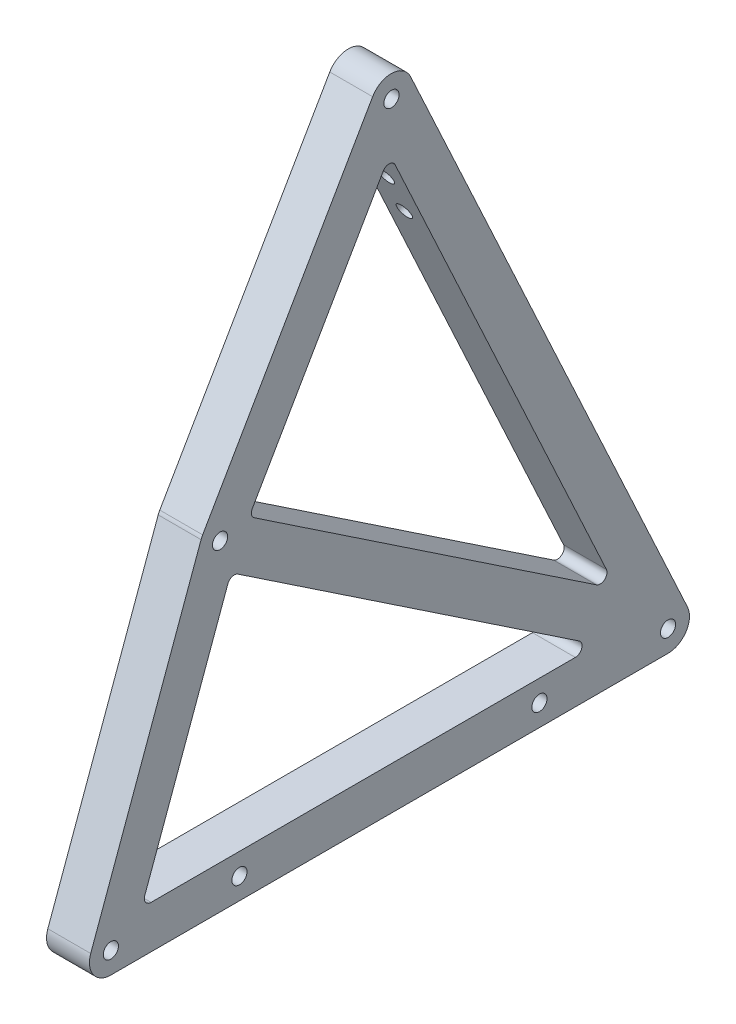
ISO-10303-21;
HEADER;
FILE_DESCRIPTION(('STEP AP214'),'2;1');
FILE_NAME('part.step','',(''),(''),'','','');
FILE_SCHEMA(('AUTOMOTIVE_DESIGN { 1 0 10303 214 1 1 1 1 }'));
ENDSEC;
DATA;
#1=APPLICATION_CONTEXT('core data for automotive mechanical design processes');
#2=APPLICATION_PROTOCOL_DEFINITION('international standard','automotive_design',2000,#1);
#3=PRODUCT_CONTEXT('',#1,'mechanical');
#4=PRODUCT('Part','Part','',(#3));
#5=PRODUCT_RELATED_PRODUCT_CATEGORY('part','',(#4));
#6=PRODUCT_DEFINITION_FORMATION('','',#4);
#7=PRODUCT_DEFINITION_CONTEXT('part definition',#1,'design');
#8=PRODUCT_DEFINITION('design','',#6,#7);
#9=PRODUCT_DEFINITION_SHAPE('','',#8);
#10=(LENGTH_UNIT() NAMED_UNIT(*) SI_UNIT(.MILLI.,.METRE.));
#11=(NAMED_UNIT(*) PLANE_ANGLE_UNIT() SI_UNIT($,.RADIAN.));
#12=(NAMED_UNIT(*) SI_UNIT($,.STERADIAN.) SOLID_ANGLE_UNIT());
#13=UNCERTAINTY_MEASURE_WITH_UNIT(LENGTH_MEASURE(1.E-05),#10,'distance_accuracy_value','');
#14=(GEOMETRIC_REPRESENTATION_CONTEXT(3) GLOBAL_UNCERTAINTY_ASSIGNED_CONTEXT((#13)) GLOBAL_UNIT_ASSIGNED_CONTEXT((#10,
#11,#12)) REPRESENTATION_CONTEXT('',''));
#15=CARTESIAN_POINT('',(0.,0.,0.));
#16=DIRECTION('',(0.,0.,1.));
#17=DIRECTION('',(1.,0.,0.));
#18=AXIS2_PLACEMENT_3D('',#15,#16,#17);
#19=CARTESIAN_POINT('',(12.7,0.,0.));
#20=DIRECTION('',(1.,0.,0.));
#21=DIRECTION('',(0.,0.,-1.));
#22=AXIS2_PLACEMENT_3D('',#19,#20,#21);
#23=PLANE('',#22);
#24=CARTESIAN_POINT('',(12.7,-88.9,-5.7430461737342));
#25=DIRECTION('',(1.,0.,0.));
#26=DIRECTION('',(0.,0.,-1.));
#27=AXIS2_PLACEMENT_3D('',#24,#25,#26);
#28=CIRCLE('',#27,2.25);
#29=CARTESIAN_POINT('',(12.7,-88.9,-7.9930461737342));
#30=VERTEX_POINT('',#29);
#31=EDGE_CURVE('E753',#30,#30,#28,.T.);
#32=ORIENTED_EDGE('',*,*,#31,.F.);
#33=EDGE_LOOP('',(#32));
#34=FACE_BOUND('',#33,.T.);
#35=CARTESIAN_POINT('',(12.7,-88.9,32.3569538262658));
#36=DIRECTION('',(1.,0.,0.));
#37=DIRECTION('',(0.,0.,-1.));
#38=AXIS2_PLACEMENT_3D('',#35,#36,#37);
#39=CIRCLE('',#38,2.25);
#40=CARTESIAN_POINT('',(12.7,-88.9,30.1069538262658));
#41=VERTEX_POINT('',#40);
#42=EDGE_CURVE('E737',#41,#41,#39,.T.);
#43=ORIENTED_EDGE('',*,*,#42,.F.);
#44=EDGE_LOOP('',(#43));
#45=FACE_BOUND('',#44,.T.);
#46=CARTESIAN_POINT('',(12.7,0.,0.));
#47=DIRECTION('',(1.,0.,0.));
#48=DIRECTION('',(0.,0.,-1.));
#49=AXIS2_PLACEMENT_3D('',#46,#47,#48);
#50=CIRCLE('',#49,2.25);
#51=CARTESIAN_POINT('',(12.7,0.,-2.25));
#52=VERTEX_POINT('',#51);
#53=EDGE_CURVE('E697',#52,#52,#50,.T.);
#54=ORIENTED_EDGE('',*,*,#53,.F.);
#55=EDGE_LOOP('',(#54));
#56=FACE_BOUND('',#55,.T.);
#57=DIRECTION('',(0.,0.,-1.));
#58=VECTOR('',#57,1.);
#59=CARTESIAN_POINT('',(12.7,-95.25,41.4256936690783));
#60=LINE('',#59,#58);
#61=CARTESIAN_POINT('',(12.7,-95.25,32.3569538262658));
#62=VERTEX_POINT('',#61);
#63=CARTESIAN_POINT('',(12.7,-95.25,-132.743046173734));
#64=VERTEX_POINT('',#63);
#65=EDGE_CURVE('E372',#62,#64,#60,.T.);
#66=ORIENTED_EDGE('',*,*,#65,.T.);
#67=CARTESIAN_POINT('',(12.7,-88.9,-132.743046173734));
#68=DIRECTION('',(1.,0.,0.));
#69=DIRECTION('',(0.,0.,-1.));
#70=AXIS2_PLACEMENT_3D('',#67,#68,#69);
#71=CIRCLE('',#70,6.35);
#72=CARTESIAN_POINT('',(12.7,-86.2308643075973,-138.504835362479));
#73=VERTEX_POINT('',#72);
#74=EDGE_CURVE('E243',#64,#73,#71,.T.);
#75=ORIENTED_EDGE('',*,*,#74,.T.);
#76=DIRECTION('',(0.,0.907368376180359,0.420336329512234));
#77=VECTOR('',#76,1.);
#78=CARTESIAN_POINT('',(12.7,-95.25,-142.682929388939));
#79=LINE('',#78,#77);
#80=CARTESIAN_POINT('',(12.7,90.8510513187063,-56.4720420765911));
#81=VERTEX_POINT('',#80);
#82=EDGE_CURVE('E198',#73,#81,#79,.T.);
#83=ORIENTED_EDGE('',*,*,#82,.T.);
#84=CARTESIAN_POINT('',(12.7,88.1819156263036,-50.7102528878458));
#85=DIRECTION('',(1.,0.,0.));
#86=DIRECTION('',(0.,0.,-1.));
#87=AXIS2_PLACEMENT_3D('',#84,#85,#86);
#88=CIRCLE('',#87,6.35);
#89=CARTESIAN_POINT('',(12.7,91.3569156263036,-45.2109915738146));
#90=VERTEX_POINT('',#89);
#91=EDGE_CURVE('E240',#81,#90,#88,.T.);
#92=ORIENTED_EDGE('',*,*,#91,.T.);
#93=DIRECTION('',(0.,-0.86602540378444,0.499999999999998));
#94=VECTOR('',#93,1.);
#95=CARTESIAN_POINT('',(12.7,101.953428548783,-51.3288911620796));
#96=LINE('',#95,#94);
#97=CARTESIAN_POINT('',(12.7,4.11979240632557,5.15538500056795));
#98=VERTEX_POINT('',#97);
#99=EDGE_CURVE('E220',#90,#98,#96,.T.);
#100=ORIENTED_EDGE('',*,*,#99,.T.);
#101=CARTESIAN_POINT('',(12.7,0.944792406325579,-0.343876313463227));
#102=DIRECTION('',(1.,0.,0.));
#103=DIRECTION('',(0.,0.,-1.));
#104=AXIS2_PLACEMENT_3D('',#101,#102,#103);
#105=CIRCLE('',#104,6.35);
#106=CARTESIAN_POINT('',(12.7,3.1166203164436,5.62317182852728));
#107=VERTEX_POINT('',#106);
#108=EDGE_CURVE('E237',#98,#107,#105,.T.);
#109=ORIENTED_EDGE('',*,*,#108,.T.);
#110=DIRECTION('',(0.,-0.939692620785907,0.342020143325672));
#111=VECTOR('',#110,1.);
#112=CARTESIAN_POINT('',(12.7,3.63866938358114,5.43316150726278));
#113=LINE('',#112,#111);
#114=CARTESIAN_POINT('',(12.7,-86.7281720898819,38.3240019682563));
#115=VERTEX_POINT('',#114);
#116=EDGE_CURVE('E213',#107,#115,#113,.T.);
#117=ORIENTED_EDGE('',*,*,#116,.T.);
#118=CARTESIAN_POINT('',(12.7,-88.9,32.3569538262658));
#119=DIRECTION('',(1.,0.,0.));
#120=DIRECTION('',(0.,0.,-1.));
#121=AXIS2_PLACEMENT_3D('',#118,#119,#120);
#122=CIRCLE('',#121,6.35);
#123=EDGE_CURVE('E234',#115,#62,#122,.T.);
#124=ORIENTED_EDGE('',*,*,#123,.T.);
#125=EDGE_LOOP('',(#66,#75,#83,#92,#100,#109,#117,#124));
#126=FACE_BOUND('',#125,.T.);
#127=DIRECTION('',(0.,0.556452400075958,0.830879489727425));
#128=VECTOR('',#127,1.);
#129=CARTESIAN_POINT('',(12.7,-9.78336526190608,-3.19667510893422));
#130=LINE('',#129,#128);
#131=CARTESIAN_POINT('',(12.7,-78.8882410205452,-106.382183699026));
#132=VERTEX_POINT('',#131);
#133=CARTESIAN_POINT('',(12.7,-11.2029811680909,-5.31640671504968));
#134=VERTEX_POINT('',#133);
#135=EDGE_CURVE('E347',#132,#134,#130,.T.);
#136=ORIENTED_EDGE('',*,*,#135,.F.);
#137=CARTESIAN_POINT('',(12.7,-80.55,-105.269278898875));
#138=DIRECTION('',(1.,0.,0.));
#139=DIRECTION('',(0.,0.,-1.));
#140=AXIS2_PLACEMENT_3D('',#137,#138,#139);
#141=CIRCLE('',#140,2.);
#142=CARTESIAN_POINT('',(12.7,-82.55,-105.269278898875));
#143=VERTEX_POINT('',#142);
#144=EDGE_CURVE('E322',#132,#143,#141,.F.);
#145=ORIENTED_EDGE('',*,*,#144,.T.);
#146=DIRECTION('',(0.,0.,-1.));
#147=VECTOR('',#146,1.);
#148=CARTESIAN_POINT('',(12.7,-82.55,-111.849821958721));
#149=LINE('',#148,#147);
#150=CARTESIAN_POINT('',(12.7,-82.55,20.4319179699691));
#151=VERTEX_POINT('',#150);
#152=EDGE_CURVE('E341',#151,#143,#149,.T.);
#153=ORIENTED_EDGE('',*,*,#152,.F.);
#154=CARTESIAN_POINT('',(12.7,-80.55,20.4319179699691));
#155=DIRECTION('',(1.,0.,0.));
#156=DIRECTION('',(0.,0.,-1.));
#157=AXIS2_PLACEMENT_3D('',#154,#155,#156);
#158=CIRCLE('',#157,2.);
#159=CARTESIAN_POINT('',(12.7,-79.8659597133486,22.3113032115409));
#160=VERTEX_POINT('',#159);
#161=EDGE_CURVE('E54',#151,#160,#158,.F.);
#162=ORIENTED_EDGE('',*,*,#161,.T.);
#163=DIRECTION('',(0.,-0.939692620785907,0.342020143325673));
#164=VECTOR('',#163,1.);
#165=CARTESIAN_POINT('',(12.7,-82.55,23.2882139834533));
#166=LINE('',#165,#164);
#167=CARTESIAN_POINT('',(12.7,-12.1806998608944,-2.32411667332594));
#168=VERTEX_POINT('',#167);
#169=EDGE_CURVE('E349',#168,#160,#166,.T.);
#170=ORIENTED_EDGE('',*,*,#169,.F.);
#171=CARTESIAN_POINT('',(12.7,-12.8647401475458,-4.20350191489777));
#172=DIRECTION('',(1.,0.,0.));
#173=DIRECTION('',(0.,0.,-1.));
#174=AXIS2_PLACEMENT_3D('',#171,#172,#173);
#175=CIRCLE('',#174,2.);
#176=EDGE_CURVE('E11',#168,#134,#175,.F.);
#177=ORIENTED_EDGE('',*,*,#176,.T.);
#178=EDGE_LOOP('',(#136,#145,#153,#162,#170,#177));
#179=FACE_BOUND('',#178,.T.);
#180=DIRECTION('',(0.,-0.556452400075958,-0.830879489727425));
#181=VECTOR('',#180,1.);
#182=CARTESIAN_POINT('',(12.7,1.87277804038734,-8.61519716111546));
#183=LINE('',#182,#181);
#184=CARTESIAN_POINT('',(12.7,0.831537067402185,-10.1699496757943));
#185=VERTEX_POINT('',#184);
#186=CARTESIAN_POINT('',(12.7,-67.0569263400964,-111.539144645034));
#187=VERTEX_POINT('',#186);
#188=EDGE_CURVE('E712',#185,#187,#183,.T.);
#189=ORIENTED_EDGE('',*,*,#188,.F.);
#190=CARTESIAN_POINT('',(12.7,2.49329604685702,-11.2828544759462));
#191=DIRECTION('',(1.,0.,0.));
#192=DIRECTION('',(0.,0.,-1.));
#193=AXIS2_PLACEMENT_3D('',#190,#191,#192);
#194=CIRCLE('',#193,2.);
#195=CARTESIAN_POINT('',(12.7,3.49329604685702,-9.55080366837736));
#196=VERTEX_POINT('',#195);
#197=EDGE_CURVE('E310',#185,#196,#194,.F.);
#198=ORIENTED_EDGE('',*,*,#197,.T.);
#199=DIRECTION('',(0.,-0.86602540378444,0.499999999999998));
#200=VECTOR('',#199,1.);
#201=CARTESIAN_POINT('',(12.7,74.0229335002148,-50.2711088379199));
#202=LINE('',#201,#200);
#203=CARTESIAN_POINT('',(12.7,70.6854491151818,-48.344211329805));
#204=VERTEX_POINT('',#203);
#205=EDGE_CURVE('E706',#204,#196,#202,.T.);
#206=ORIENTED_EDGE('',*,*,#205,.F.);
#207=CARTESIAN_POINT('',(12.7,69.6854491151818,-50.0762621373739));
#208=DIRECTION('',(1.,0.,0.));
#209=DIRECTION('',(0.,0.,-1.));
#210=AXIS2_PLACEMENT_3D('',#207,#208,#209);
#211=CIRCLE('',#210,2.);
#212=CARTESIAN_POINT('',(12.7,70.5261217742063,-51.8909988897346));
#213=VERTEX_POINT('',#212);
#214=EDGE_CURVE('E304',#204,#213,#211,.F.);
#215=ORIENTED_EDGE('',*,*,#214,.T.);
#216=DIRECTION('',(0.,0.90736837618036,0.420336329512234));
#217=VECTOR('',#216,1.);
#218=CARTESIAN_POINT('',(12.7,-71.0250673940208,-117.464264230467));
#219=LINE('',#218,#217);
#220=CARTESIAN_POINT('',(12.7,-64.5544947016171,-114.466786197547));
#221=VERTEX_POINT('',#220);
#222=EDGE_CURVE('E366',#221,#213,#219,.T.);
#223=ORIENTED_EDGE('',*,*,#222,.F.);
#224=CARTESIAN_POINT('',(12.7,-65.3951673606416,-112.652049445186));
#225=DIRECTION('',(1.,0.,0.));
#226=DIRECTION('',(0.,0.,-1.));
#227=AXIS2_PLACEMENT_3D('',#224,#225,#226);
#228=CIRCLE('',#227,2.);
#229=EDGE_CURVE('E316',#221,#187,#228,.F.);
#230=ORIENTED_EDGE('',*,*,#229,.T.);
#231=EDGE_LOOP('',(#189,#198,#206,#215,#223,#230));
#232=FACE_BOUND('',#231,.T.);
#233=CARTESIAN_POINT('',(12.7,87.9881810244991,-50.7999999999998));
#234=DIRECTION('',(1.,0.,0.));
#235=DIRECTION('',(0.,0.,-1.));
#236=AXIS2_PLACEMENT_3D('',#233,#234,#235);
#237=CIRCLE('',#236,2.25);
#238=CARTESIAN_POINT('',(12.7,87.9881810244991,-53.0499999999998));
#239=VERTEX_POINT('',#238);
#240=EDGE_CURVE('E729',#239,#239,#237,.T.);
#241=ORIENTED_EDGE('',*,*,#240,.F.);
#242=EDGE_LOOP('',(#241));
#243=FACE_BOUND('',#242,.T.);
#244=CARTESIAN_POINT('',(12.7,-88.9,-132.743046173734));
#245=DIRECTION('',(1.,0.,0.));
#246=DIRECTION('',(0.,0.,-1.));
#247=AXIS2_PLACEMENT_3D('',#244,#245,#246);
#248=CIRCLE('',#247,2.24999999999998);
#249=CARTESIAN_POINT('',(12.7,-88.9,-134.993046173734));
#250=VERTEX_POINT('',#249);
#251=EDGE_CURVE('E745',#250,#250,#248,.T.);
#252=ORIENTED_EDGE('',*,*,#251,.F.);
#253=EDGE_LOOP('',(#252));
#254=FACE_BOUND('',#253,.T.);
#255=CARTESIAN_POINT('',(12.7,-88.9,-94.6430461737342));
#256=DIRECTION('',(1.,0.,0.));
#257=DIRECTION('',(0.,0.,-1.));
#258=AXIS2_PLACEMENT_3D('',#255,#256,#257);
#259=CIRCLE('',#258,2.25);
#260=CARTESIAN_POINT('',(12.7,-88.9,-96.8930461737342));
#261=VERTEX_POINT('',#260);
#262=EDGE_CURVE('E761',#261,#261,#259,.T.);
#263=ORIENTED_EDGE('',*,*,#262,.F.);
#264=EDGE_LOOP('',(#263));
#265=FACE_BOUND('',#264,.T.);
#266=ADVANCED_FACE('F38',(#34,#45,#56,#126,#179,#232,#243,#254,#265),#23,.T.);
#267=CARTESIAN_POINT('',(0.,0.,0.));
#268=DIRECTION('',(1.,0.,0.));
#269=DIRECTION('',(0.,0.,-1.));
#270=AXIS2_PLACEMENT_3D('',#267,#268,#269);
#271=PLANE('',#270);
#272=DIRECTION('',(0.,-0.939692620785907,0.342020143325673));
#273=VECTOR('',#272,1.);
#274=CARTESIAN_POINT('',(0.,-82.55,23.2882139834533));
#275=LINE('',#274,#273);
#276=CARTESIAN_POINT('',(0.,-12.1806998608944,-2.32411667332594));
#277=VERTEX_POINT('',#276);
#278=CARTESIAN_POINT('',(0.,-79.8659597133486,22.3113032115409));
#279=VERTEX_POINT('',#278);
#280=EDGE_CURVE('E333',#277,#279,#275,.T.);
#281=ORIENTED_EDGE('',*,*,#280,.T.);
#282=CARTESIAN_POINT('',(0.,-80.55,20.4319179699691));
#283=DIRECTION('',(1.,0.,0.));
#284=DIRECTION('',(0.,0.,-1.));
#285=AXIS2_PLACEMENT_3D('',#282,#283,#284);
#286=CIRCLE('',#285,2.);
#287=CARTESIAN_POINT('',(0.,-82.55,20.4319179699691));
#288=VERTEX_POINT('',#287);
#289=EDGE_CURVE('E325',#279,#288,#286,.T.);
#290=ORIENTED_EDGE('',*,*,#289,.T.);
#291=DIRECTION('',(0.,0.,-1.));
#292=VECTOR('',#291,1.);
#293=CARTESIAN_POINT('',(0.,-82.55,-111.849821958721));
#294=LINE('',#293,#292);
#295=CARTESIAN_POINT('',(0.,-82.55,-105.269278898875));
#296=VERTEX_POINT('',#295);
#297=EDGE_CURVE('E362',#288,#296,#294,.T.);
#298=ORIENTED_EDGE('',*,*,#297,.T.);
#299=CARTESIAN_POINT('',(0.,-80.55,-105.269278898875));
#300=DIRECTION('',(1.,0.,0.));
#301=DIRECTION('',(0.,0.,-1.));
#302=AXIS2_PLACEMENT_3D('',#299,#300,#301);
#303=CIRCLE('',#302,2.);
#304=CARTESIAN_POINT('',(0.,-78.8882410205452,-106.382183699026));
#305=VERTEX_POINT('',#304);
#306=EDGE_CURVE('E319',#296,#305,#303,.T.);
#307=ORIENTED_EDGE('',*,*,#306,.T.);
#308=DIRECTION('',(0.,0.556452400075958,0.830879489727425));
#309=VECTOR('',#308,1.);
#310=CARTESIAN_POINT('',(0.,-9.78336526190608,-3.19667510893422));
#311=LINE('',#310,#309);
#312=CARTESIAN_POINT('',(0.,-11.2029811680909,-5.31640671504968));
#313=VERTEX_POINT('',#312);
#314=EDGE_CURVE('E335',#305,#313,#311,.T.);
#315=ORIENTED_EDGE('',*,*,#314,.T.);
#316=CARTESIAN_POINT('',(0.,-12.8647401475458,-4.20350191489777));
#317=DIRECTION('',(1.,0.,0.));
#318=DIRECTION('',(0.,0.,-1.));
#319=AXIS2_PLACEMENT_3D('',#316,#317,#318);
#320=CIRCLE('',#319,2.);
#321=EDGE_CURVE('E47',#313,#277,#320,.T.);
#322=ORIENTED_EDGE('',*,*,#321,.T.);
#323=EDGE_LOOP('',(#281,#290,#298,#307,#315,#322));
#324=FACE_BOUND('',#323,.T.);
#325=DIRECTION('',(0.,0.907368376180359,0.420336329512234));
#326=VECTOR('',#325,1.);
#327=CARTESIAN_POINT('',(0.,-95.25,-142.682929388939));
#328=LINE('',#327,#326);
#329=CARTESIAN_POINT('',(0.,-86.2308643075973,-138.504835362479));
#330=VERTEX_POINT('',#329);
#331=CARTESIAN_POINT('',(0.,90.8510513187063,-56.4720420765911));
#332=VERTEX_POINT('',#331);
#333=EDGE_CURVE('E195',#330,#332,#328,.T.);
#334=ORIENTED_EDGE('',*,*,#333,.F.);
#335=CARTESIAN_POINT('',(0.,-88.9,-132.743046173734));
#336=DIRECTION('',(1.,0.,0.));
#337=DIRECTION('',(0.,0.,-1.));
#338=AXIS2_PLACEMENT_3D('',#335,#336,#337);
#339=CIRCLE('',#338,6.35);
#340=CARTESIAN_POINT('',(0.,-95.25,-132.743046173734));
#341=VERTEX_POINT('',#340);
#342=EDGE_CURVE('E177',#330,#341,#339,.F.);
#343=ORIENTED_EDGE('',*,*,#342,.T.);
#344=DIRECTION('',(0.,0.,-1.));
#345=VECTOR('',#344,1.);
#346=CARTESIAN_POINT('',(0.,-95.25,41.4256936690783));
#347=LINE('',#346,#345);
#348=CARTESIAN_POINT('',(0.,-95.25,32.3569538262658));
#349=VERTEX_POINT('',#348);
#350=EDGE_CURVE('E208',#349,#341,#347,.T.);
#351=ORIENTED_EDGE('',*,*,#350,.F.);
#352=CARTESIAN_POINT('',(0.,-88.9,32.3569538262658));
#353=DIRECTION('',(1.,0.,0.));
#354=DIRECTION('',(0.,0.,-1.));
#355=AXIS2_PLACEMENT_3D('',#352,#353,#354);
#356=CIRCLE('',#355,6.35);
#357=CARTESIAN_POINT('',(0.,-86.7281720898819,38.3240019682563));
#358=VERTEX_POINT('',#357);
#359=EDGE_CURVE('E200',#349,#358,#356,.F.);
#360=ORIENTED_EDGE('',*,*,#359,.T.);
#361=DIRECTION('',(0.,-0.939692620785907,0.342020143325672));
#362=VECTOR('',#361,1.);
#363=CARTESIAN_POINT('',(0.,3.63866938358114,5.43316150726278));
#364=LINE('',#363,#362);
#365=CARTESIAN_POINT('',(0.,3.1166203164436,5.62317182852728));
#366=VERTEX_POINT('',#365);
#367=EDGE_CURVE('E215',#366,#358,#364,.T.);
#368=ORIENTED_EDGE('',*,*,#367,.F.);
#369=CARTESIAN_POINT('',(0.,0.944792406325579,-0.343876313463227));
#370=DIRECTION('',(1.,0.,0.));
#371=DIRECTION('',(0.,0.,-1.));
#372=AXIS2_PLACEMENT_3D('',#369,#370,#371);
#373=CIRCLE('',#372,6.35);
#374=CARTESIAN_POINT('',(0.,4.11979240632557,5.15538500056795));
#375=VERTEX_POINT('',#374);
#376=EDGE_CURVE('E224',#366,#375,#373,.F.);
#377=ORIENTED_EDGE('',*,*,#376,.T.);
#378=DIRECTION('',(0.,-0.86602540378444,0.499999999999998));
#379=VECTOR('',#378,1.);
#380=CARTESIAN_POINT('',(0.,101.953428548783,-51.3288911620796));
#381=LINE('',#380,#379);
#382=CARTESIAN_POINT('',(0.,91.3569156263036,-45.2109915738146));
#383=VERTEX_POINT('',#382);
#384=EDGE_CURVE('E207',#383,#375,#381,.T.);
#385=ORIENTED_EDGE('',*,*,#384,.F.);
#386=CARTESIAN_POINT('',(0.,88.1819156263036,-50.7102528878458));
#387=DIRECTION('',(1.,0.,0.));
#388=DIRECTION('',(0.,0.,-1.));
#389=AXIS2_PLACEMENT_3D('',#386,#387,#388);
#390=CIRCLE('',#389,6.35);
#391=EDGE_CURVE('E189',#383,#332,#390,.F.);
#392=ORIENTED_EDGE('',*,*,#391,.T.);
#393=EDGE_LOOP('',(#334,#343,#351,#360,#368,#377,#385,#392));
#394=FACE_BOUND('',#393,.T.);
#395=DIRECTION('',(0.,0.90736837618036,0.420336329512234));
#396=VECTOR('',#395,1.);
#397=CARTESIAN_POINT('',(0.,-71.0250673940208,-117.464264230467));
#398=LINE('',#397,#396);
#399=CARTESIAN_POINT('',(0.,-64.5544947016171,-114.466786197547));
#400=VERTEX_POINT('',#399);
#401=CARTESIAN_POINT('',(0.,70.5261217742063,-51.8909988897346));
#402=VERTEX_POINT('',#401);
#403=EDGE_CURVE('E721',#400,#402,#398,.T.);
#404=ORIENTED_EDGE('',*,*,#403,.T.);
#405=CARTESIAN_POINT('',(0.,69.6854491151818,-50.0762621373739));
#406=DIRECTION('',(1.,0.,0.));
#407=DIRECTION('',(0.,0.,-1.));
#408=AXIS2_PLACEMENT_3D('',#405,#406,#407);
#409=CIRCLE('',#408,2.);
#410=CARTESIAN_POINT('',(0.,70.6854491151818,-48.344211329805));
#411=VERTEX_POINT('',#410);
#412=EDGE_CURVE('E301',#402,#411,#409,.T.);
#413=ORIENTED_EDGE('',*,*,#412,.T.);
#414=DIRECTION('',(0.,-0.86602540378444,0.499999999999998));
#415=VECTOR('',#414,1.);
#416=CARTESIAN_POINT('',(0.,74.0229335002148,-50.2711088379199));
#417=LINE('',#416,#415);
#418=CARTESIAN_POINT('',(0.,3.49329604685702,-9.55080366837736));
#419=VERTEX_POINT('',#418);
#420=EDGE_CURVE('E690',#411,#419,#417,.T.);
#421=ORIENTED_EDGE('',*,*,#420,.T.);
#422=CARTESIAN_POINT('',(0.,2.49329604685702,-11.2828544759462));
#423=DIRECTION('',(1.,0.,0.));
#424=DIRECTION('',(0.,0.,-1.));
#425=AXIS2_PLACEMENT_3D('',#422,#423,#424);
#426=CIRCLE('',#425,2.);
#427=CARTESIAN_POINT('',(0.,0.831537067402185,-10.1699496757943));
#428=VERTEX_POINT('',#427);
#429=EDGE_CURVE('E307',#419,#428,#426,.T.);
#430=ORIENTED_EDGE('',*,*,#429,.T.);
#431=DIRECTION('',(0.,-0.556452400075958,-0.830879489727425));
#432=VECTOR('',#431,1.);
#433=CARTESIAN_POINT('',(0.,1.87277804038734,-8.61519716111546));
#434=LINE('',#433,#432);
#435=CARTESIAN_POINT('',(0.,-67.0569263400964,-111.539144645034));
#436=VERTEX_POINT('',#435);
#437=EDGE_CURVE('E696',#428,#436,#434,.T.);
#438=ORIENTED_EDGE('',*,*,#437,.T.);
#439=CARTESIAN_POINT('',(0.,-65.3951673606416,-112.652049445186));
#440=DIRECTION('',(1.,0.,0.));
#441=DIRECTION('',(0.,0.,-1.));
#442=AXIS2_PLACEMENT_3D('',#439,#440,#441);
#443=CIRCLE('',#442,2.);
#444=EDGE_CURVE('E313',#436,#400,#443,.T.);
#445=ORIENTED_EDGE('',*,*,#444,.T.);
#446=EDGE_LOOP('',(#404,#413,#421,#430,#438,#445));
#447=FACE_BOUND('',#446,.T.);
#448=CARTESIAN_POINT('',(0.,0.,0.));
#449=DIRECTION('',(1.,0.,0.));
#450=DIRECTION('',(0.,0.,-1.));
#451=AXIS2_PLACEMENT_3D('',#448,#449,#450);
#452=CIRCLE('',#451,2.25);
#453=CARTESIAN_POINT('',(0.,0.,-2.25));
#454=VERTEX_POINT('',#453);
#455=EDGE_CURVE('E725',#454,#454,#452,.T.);
#456=ORIENTED_EDGE('',*,*,#455,.T.);
#457=EDGE_LOOP('',(#456));
#458=FACE_BOUND('',#457,.T.);
#459=CARTESIAN_POINT('',(0.,87.9881810244991,-50.7999999999998));
#460=DIRECTION('',(1.,0.,0.));
#461=DIRECTION('',(0.,0.,-1.));
#462=AXIS2_PLACEMENT_3D('',#459,#460,#461);
#463=CIRCLE('',#462,2.25);
#464=CARTESIAN_POINT('',(0.,87.9881810244991,-53.0499999999998));
#465=VERTEX_POINT('',#464);
#466=EDGE_CURVE('E733',#465,#465,#463,.T.);
#467=ORIENTED_EDGE('',*,*,#466,.T.);
#468=EDGE_LOOP('',(#467));
#469=FACE_BOUND('',#468,.T.);
#470=CARTESIAN_POINT('',(0.,-88.9,32.3569538262658));
#471=DIRECTION('',(1.,0.,0.));
#472=DIRECTION('',(0.,0.,-1.));
#473=AXIS2_PLACEMENT_3D('',#470,#471,#472);
#474=CIRCLE('',#473,2.25);
#475=CARTESIAN_POINT('',(0.,-88.9,30.1069538262658));
#476=VERTEX_POINT('',#475);
#477=EDGE_CURVE('E741',#476,#476,#474,.T.);
#478=ORIENTED_EDGE('',*,*,#477,.T.);
#479=EDGE_LOOP('',(#478));
#480=FACE_BOUND('',#479,.T.);
#481=CARTESIAN_POINT('',(0.,-88.9,-132.743046173734));
#482=DIRECTION('',(1.,0.,0.));
#483=DIRECTION('',(0.,0.,-1.));
#484=AXIS2_PLACEMENT_3D('',#481,#482,#483);
#485=CIRCLE('',#484,2.24999999999998);
#486=CARTESIAN_POINT('',(0.,-88.9,-134.993046173734));
#487=VERTEX_POINT('',#486);
#488=EDGE_CURVE('E749',#487,#487,#485,.T.);
#489=ORIENTED_EDGE('',*,*,#488,.T.);
#490=EDGE_LOOP('',(#489));
#491=FACE_BOUND('',#490,.T.);
#492=CARTESIAN_POINT('',(0.,-88.9,-5.7430461737342));
#493=DIRECTION('',(1.,0.,0.));
#494=DIRECTION('',(0.,0.,-1.));
#495=AXIS2_PLACEMENT_3D('',#492,#493,#494);
#496=CIRCLE('',#495,2.25);
#497=CARTESIAN_POINT('',(0.,-88.9,-7.9930461737342));
#498=VERTEX_POINT('',#497);
#499=EDGE_CURVE('E757',#498,#498,#496,.T.);
#500=ORIENTED_EDGE('',*,*,#499,.T.);
#501=EDGE_LOOP('',(#500));
#502=FACE_BOUND('',#501,.T.);
#503=CARTESIAN_POINT('',(0.,-88.9,-94.6430461737342));
#504=DIRECTION('',(1.,0.,0.));
#505=DIRECTION('',(0.,0.,-1.));
#506=AXIS2_PLACEMENT_3D('',#503,#504,#505);
#507=CIRCLE('',#506,2.25);
#508=CARTESIAN_POINT('',(0.,-88.9,-96.8930461737342));
#509=VERTEX_POINT('',#508);
#510=EDGE_CURVE('E765',#509,#509,#507,.T.);
#511=ORIENTED_EDGE('',*,*,#510,.T.);
#512=EDGE_LOOP('',(#511));
#513=FACE_BOUND('',#512,.T.);
#514=ADVANCED_FACE('F203',(#324,#394,#447,#458,#469,#480,#491,#502,#513),#271,.F.);
#515=CARTESIAN_POINT('',(12.7,3.63866938358114,5.43316150726278));
#516=DIRECTION('',(0.,-0.342020143325672,-0.939692620785907));
#517=DIRECTION('',(0.,0.939692620785907,-0.342020143325672));
#518=AXIS2_PLACEMENT_3D('',#515,#516,#517);
#519=PLANE('',#518);
#520=ORIENTED_EDGE('',*,*,#116,.F.);
#521=DIRECTION('',(-1.,0.,0.));
#522=VECTOR('',#521,1.);
#523=CARTESIAN_POINT('',(12.7,3.1166203164436,5.62317182852728));
#524=LINE('',#523,#522);
#525=EDGE_CURVE('E256',#107,#366,#524,.T.);
#526=ORIENTED_EDGE('',*,*,#525,.T.);
#527=ORIENTED_EDGE('',*,*,#367,.T.);
#528=DIRECTION('',(-1.,0.,0.));
#529=VECTOR('',#528,1.);
#530=CARTESIAN_POINT('',(12.7,-86.728172089882,38.3240019682563));
#531=LINE('',#530,#529);
#532=EDGE_CURVE('E253',#358,#115,#531,.F.);
#533=ORIENTED_EDGE('',*,*,#532,.T.);
#534=EDGE_LOOP('',(#520,#526,#527,#533));
#535=FACE_BOUND('',#534,.T.);
#536=ADVANCED_FACE('F386',(#535),#519,.F.);
#537=CARTESIAN_POINT('',(12.7,-95.25,41.4256936690783));
#538=DIRECTION('',(0.,1.,0.));
#539=DIRECTION('',(0.,0.,1.));
#540=AXIS2_PLACEMENT_3D('',#537,#538,#539);
#541=PLANE('',#540);
#542=ORIENTED_EDGE('',*,*,#350,.T.);
#543=DIRECTION('',(-1.,0.,0.));
#544=VECTOR('',#543,1.);
#545=CARTESIAN_POINT('',(12.7,-95.25,-132.743046173734));
#546=LINE('',#545,#544);
#547=EDGE_CURVE('E182',#341,#64,#546,.F.);
#548=ORIENTED_EDGE('',*,*,#547,.T.);
#549=ORIENTED_EDGE('',*,*,#65,.F.);
#550=DIRECTION('',(-1.,0.,0.));
#551=VECTOR('',#550,1.);
#552=CARTESIAN_POINT('',(12.7,-95.25,32.3569538262658));
#553=LINE('',#552,#551);
#554=EDGE_CURVE('E188',#62,#349,#553,.T.);
#555=ORIENTED_EDGE('',*,*,#554,.T.);
#556=EDGE_LOOP('',(#542,#548,#549,#555));
#557=FACE_BOUND('',#556,.T.);
#558=ADVANCED_FACE('F395',(#557),#541,.F.);
#559=CARTESIAN_POINT('',(12.7,-95.25,-142.682929388939));
#560=DIRECTION('',(0.,-0.420336329512234,0.907368376180359));
#561=DIRECTION('',(0.,-0.907368376180359,-0.420336329512235));
#562=AXIS2_PLACEMENT_3D('',#559,#560,#561);
#563=PLANE('',#562);
#564=CARTESIAN_POINT('',(6.35000000000001,67.8038945637252,-67.1485848462018));
#565=DIRECTION('',(0.,0.420336329512235,-0.907368376180359));
#566=DIRECTION('',(0.,0.907368376180359,0.420336329512235));
#567=AXIS2_PLACEMENT_3D('',#564,#565,#566);
#568=CIRCLE('',#567,2.25);
#569=CARTESIAN_POINT('',(6.35000000000001,69.845473410131,-66.2028281047993));
#570=VERTEX_POINT('',#569);
#571=EDGE_CURVE('E769',#570,#570,#568,.T.);
#572=ORIENTED_EDGE('',*,*,#571,.F.);
#573=EDGE_LOOP('',(#572));
#574=FACE_BOUND('',#573,.T.);
#575=CARTESIAN_POINT('',(6.35000000000001,56.2803161862346,-72.4868562310072));
#576=DIRECTION('',(0.,0.420336329512235,-0.907368376180359));
#577=DIRECTION('',(0.,0.907368376180359,0.420336329512235));
#578=AXIS2_PLACEMENT_3D('',#575,#576,#577);
#579=CIRCLE('',#578,2.25);
#580=CARTESIAN_POINT('',(6.35000000000001,58.3218950326404,-71.5410994896047));
#581=VERTEX_POINT('',#580);
#582=EDGE_CURVE('E777',#581,#581,#579,.T.);
#583=ORIENTED_EDGE('',*,*,#582,.F.);
#584=EDGE_LOOP('',(#583));
#585=FACE_BOUND('',#584,.T.);
#586=ORIENTED_EDGE('',*,*,#82,.F.);
#587=DIRECTION('',(-1.,0.,0.));
#588=VECTOR('',#587,1.);
#589=CARTESIAN_POINT('',(12.7,-86.2308643075973,-138.504835362479));
#590=LINE('',#589,#588);
#591=EDGE_CURVE('E181',#73,#330,#590,.T.);
#592=ORIENTED_EDGE('',*,*,#591,.T.);
#593=ORIENTED_EDGE('',*,*,#333,.T.);
#594=DIRECTION('',(-1.,0.,0.));
#595=VECTOR('',#594,1.);
#596=CARTESIAN_POINT('',(12.7,90.8510513187063,-56.4720420765911));
#597=LINE('',#596,#595);
#598=EDGE_CURVE('E201',#332,#81,#597,.F.);
#599=ORIENTED_EDGE('',*,*,#598,.T.);
#600=EDGE_LOOP('',(#586,#592,#593,#599));
#601=FACE_BOUND('',#600,.T.);
#602=ADVANCED_FACE('F194',(#574,#585,#601),#563,.F.);
#603=CARTESIAN_POINT('',(12.7,101.953428548783,-51.3288911620796));
#604=DIRECTION('',(0.,-0.499999999999998,-0.86602540378444));
#605=DIRECTION('',(0.,0.86602540378444,-0.499999999999998));
#606=AXIS2_PLACEMENT_3D('',#603,#604,#605);
#607=PLANE('',#606);
#608=ORIENTED_EDGE('',*,*,#99,.F.);
#609=DIRECTION('',(-1.,0.,0.));
#610=VECTOR('',#609,1.);
#611=CARTESIAN_POINT('',(12.7,91.3569156263036,-45.2109915738146));
#612=LINE('',#611,#610);
#613=EDGE_CURVE('E249',#90,#383,#612,.T.);
#614=ORIENTED_EDGE('',*,*,#613,.T.);
#615=ORIENTED_EDGE('',*,*,#384,.T.);
#616=DIRECTION('',(-1.,0.,0.));
#617=VECTOR('',#616,1.);
#618=CARTESIAN_POINT('',(12.7,4.11979240632555,5.15538500056796));
#619=LINE('',#618,#617);
#620=EDGE_CURVE('E246',#375,#98,#619,.F.);
#621=ORIENTED_EDGE('',*,*,#620,.T.);
#622=EDGE_LOOP('',(#608,#614,#615,#621));
#623=FACE_BOUND('',#622,.T.);
#624=ADVANCED_FACE('F402',(#623),#607,.F.);
#625=CARTESIAN_POINT('',(12.7,-82.55,-111.849821958721));
#626=DIRECTION('',(0.,1.,0.));
#627=DIRECTION('',(0.,0.,1.));
#628=AXIS2_PLACEMENT_3D('',#625,#626,#627);
#629=PLANE('',#628);
#630=ORIENTED_EDGE('',*,*,#152,.T.);
#631=DIRECTION('',(-1.,0.,0.));
#632=VECTOR('',#631,1.);
#633=CARTESIAN_POINT('',(0.,-82.55,-105.269278898875));
#634=LINE('',#633,#632);
#635=EDGE_CURVE('E284',#143,#296,#634,.T.);
#636=ORIENTED_EDGE('',*,*,#635,.T.);
#637=ORIENTED_EDGE('',*,*,#297,.F.);
#638=DIRECTION('',(-1.,0.,0.));
#639=VECTOR('',#638,1.);
#640=CARTESIAN_POINT('',(12.7,-82.55,20.4319179699691));
#641=LINE('',#640,#639);
#642=EDGE_CURVE('E281',#288,#151,#641,.F.);
#643=ORIENTED_EDGE('',*,*,#642,.T.);
#644=EDGE_LOOP('',(#630,#636,#637,#643));
#645=FACE_BOUND('',#644,.T.);
#646=ADVANCED_FACE('F416',(#645),#629,.T.);
#647=CARTESIAN_POINT('',(12.7,-9.78336526190608,-3.19667510893422));
#648=DIRECTION('',(0.,-0.830879489727425,0.556452400075957));
#649=DIRECTION('',(0.,-0.556452400075958,-0.830879489727425));
#650=AXIS2_PLACEMENT_3D('',#647,#648,#649);
#651=PLANE('',#650);
#652=ORIENTED_EDGE('',*,*,#314,.F.);
#653=DIRECTION('',(-1.,0.,0.));
#654=VECTOR('',#653,1.);
#655=CARTESIAN_POINT('',(12.7,-78.8882410205451,-106.382183699026));
#656=LINE('',#655,#654);
#657=EDGE_CURVE('E292',#305,#132,#656,.F.);
#658=ORIENTED_EDGE('',*,*,#657,.T.);
#659=ORIENTED_EDGE('',*,*,#135,.T.);
#660=DIRECTION('',(-1.,0.,0.));
#661=VECTOR('',#660,1.);
#662=CARTESIAN_POINT('',(0.,-11.2029811680909,-5.31640671504968));
#663=LINE('',#662,#661);
#664=EDGE_CURVE('E288',#134,#313,#663,.T.);
#665=ORIENTED_EDGE('',*,*,#664,.T.);
#666=EDGE_LOOP('',(#652,#658,#659,#665));
#667=FACE_BOUND('',#666,.T.);
#668=ADVANCED_FACE('F351',(#667),#651,.T.);
#669=CARTESIAN_POINT('',(12.7,-82.55,23.2882139834533));
#670=DIRECTION('',(0.,-0.342020143325673,-0.939692620785907));
#671=DIRECTION('',(0.,0.939692620785907,-0.342020143325673));
#672=AXIS2_PLACEMENT_3D('',#669,#670,#671);
#673=PLANE('',#672);
#674=ORIENTED_EDGE('',*,*,#169,.T.);
#675=DIRECTION('',(-1.,0.,0.));
#676=VECTOR('',#675,1.);
#677=CARTESIAN_POINT('',(0.,-79.8659597133486,22.3113032115409));
#678=LINE('',#677,#676);
#679=EDGE_CURVE('E297',#160,#279,#678,.T.);
#680=ORIENTED_EDGE('',*,*,#679,.T.);
#681=ORIENTED_EDGE('',*,*,#280,.F.);
#682=DIRECTION('',(-1.,0.,0.));
#683=VECTOR('',#682,1.);
#684=CARTESIAN_POINT('',(12.7,-12.1806998608944,-2.32411667332594));
#685=LINE('',#684,#683);
#686=EDGE_CURVE('E61',#277,#168,#685,.F.);
#687=ORIENTED_EDGE('',*,*,#686,.T.);
#688=EDGE_LOOP('',(#674,#680,#681,#687));
#689=FACE_BOUND('',#688,.T.);
#690=ADVANCED_FACE('F338',(#689),#673,.T.);
#691=CARTESIAN_POINT('',(12.7,74.0229335002148,-50.2711088379199));
#692=DIRECTION('',(0.,-0.499999999999998,-0.86602540378444));
#693=DIRECTION('',(0.,0.86602540378444,-0.499999999999998));
#694=AXIS2_PLACEMENT_3D('',#691,#692,#693);
#695=PLANE('',#694);
#696=ORIENTED_EDGE('',*,*,#420,.F.);
#697=DIRECTION('',(-1.,0.,0.));
#698=VECTOR('',#697,1.);
#699=CARTESIAN_POINT('',(12.7,70.6854491151818,-48.344211329805));
#700=LINE('',#699,#698);
#701=EDGE_CURVE('E271',#411,#204,#700,.F.);
#702=ORIENTED_EDGE('',*,*,#701,.T.);
#703=ORIENTED_EDGE('',*,*,#205,.T.);
#704=DIRECTION('',(-1.,0.,0.));
#705=VECTOR('',#704,1.);
#706=CARTESIAN_POINT('',(0.,3.49329604685702,-9.55080366837736));
#707=LINE('',#706,#705);
#708=EDGE_CURVE('E267',#196,#419,#707,.T.);
#709=ORIENTED_EDGE('',*,*,#708,.T.);
#710=EDGE_LOOP('',(#696,#702,#703,#709));
#711=FACE_BOUND('',#710,.T.);
#712=ADVANCED_FACE('F515',(#711),#695,.T.);
#713=CARTESIAN_POINT('',(12.7,1.87277804038734,-8.61519716111546));
#714=DIRECTION('',(0.,0.830879489727425,-0.556452400075958));
#715=DIRECTION('',(0.,0.556452400075958,0.830879489727425));
#716=AXIS2_PLACEMENT_3D('',#713,#714,#715);
#717=PLANE('',#716);
#718=ORIENTED_EDGE('',*,*,#437,.F.);
#719=DIRECTION('',(-1.,0.,0.));
#720=VECTOR('',#719,1.);
#721=CARTESIAN_POINT('',(12.7,0.831537067402186,-10.1699496757943));
#722=LINE('',#721,#720);
#723=EDGE_CURVE('E278',#428,#185,#722,.F.);
#724=ORIENTED_EDGE('',*,*,#723,.T.);
#725=ORIENTED_EDGE('',*,*,#188,.T.);
#726=DIRECTION('',(-1.,0.,0.));
#727=VECTOR('',#726,1.);
#728=CARTESIAN_POINT('',(0.,-67.0569263400964,-111.539144645034));
#729=LINE('',#728,#727);
#730=EDGE_CURVE('E274',#187,#436,#729,.T.);
#731=ORIENTED_EDGE('',*,*,#730,.T.);
#732=EDGE_LOOP('',(#718,#724,#725,#731));
#733=FACE_BOUND('',#732,.T.);
#734=ADVANCED_FACE('F511',(#733),#717,.T.);
#735=CARTESIAN_POINT('',(12.7,-71.0250673940208,-117.464264230467));
#736=DIRECTION('',(0.,-0.420336329512234,0.90736837618036));
#737=DIRECTION('',(0.,-0.90736837618036,-0.420336329512234));
#738=AXIS2_PLACEMENT_3D('',#735,#736,#737);
#739=PLANE('',#738);
#740=CARTESIAN_POINT('',(6.35000000000001,62.4656231789198,-55.6250064687113));
#741=DIRECTION('',(0.,-0.420336329512234,0.90736837618036));
#742=DIRECTION('',(0.,-0.90736837618036,-0.420336329512234));
#743=AXIS2_PLACEMENT_3D('',#740,#741,#742);
#744=CIRCLE('',#743,2.25);
#745=CARTESIAN_POINT('',(6.35000000000001,60.424044332514,-56.5707632101138));
#746=VERTEX_POINT('',#745);
#747=EDGE_CURVE('E781',#746,#746,#744,.F.);
#748=ORIENTED_EDGE('',*,*,#747,.T.);
#749=EDGE_LOOP('',(#748));
#750=FACE_BOUND('',#749,.T.);
#751=CARTESIAN_POINT('',(6.35000000000001,50.9420448014292,-60.9632778535166));
#752=DIRECTION('',(0.,-0.420336329512234,0.90736837618036));
#753=DIRECTION('',(0.,-0.90736837618036,-0.420336329512234));
#754=AXIS2_PLACEMENT_3D('',#751,#752,#753);
#755=CIRCLE('',#754,2.25);
#756=CARTESIAN_POINT('',(6.35000000000001,48.9004659550234,-61.9090345949192));
#757=VERTEX_POINT('',#756);
#758=EDGE_CURVE('E773',#757,#757,#755,.F.);
#759=ORIENTED_EDGE('',*,*,#758,.T.);
#760=EDGE_LOOP('',(#759));
#761=FACE_BOUND('',#760,.T.);
#762=ORIENTED_EDGE('',*,*,#222,.T.);
#763=DIRECTION('',(-1.,0.,0.));
#764=VECTOR('',#763,1.);
#765=CARTESIAN_POINT('',(0.,70.5261217742063,-51.8909988897346));
#766=LINE('',#765,#764);
#767=EDGE_CURVE('E263',#213,#402,#766,.T.);
#768=ORIENTED_EDGE('',*,*,#767,.T.);
#769=ORIENTED_EDGE('',*,*,#403,.F.);
#770=DIRECTION('',(-1.,0.,0.));
#771=VECTOR('',#770,1.);
#772=CARTESIAN_POINT('',(12.7,-64.5544947016171,-114.466786197547));
#773=LINE('',#772,#771);
#774=EDGE_CURVE('E260',#400,#221,#773,.F.);
#775=ORIENTED_EDGE('',*,*,#774,.T.);
#776=EDGE_LOOP('',(#762,#768,#769,#775));
#777=FACE_BOUND('',#776,.T.);
#778=ADVANCED_FACE('F507',(#750,#761,#777),#739,.T.);
#779=CARTESIAN_POINT('',(12.7,0.,0.));
#780=DIRECTION('',(-1.,0.,0.));
#781=DIRECTION('',(0.,0.,1.));
#782=AXIS2_PLACEMENT_3D('',#779,#780,#781);
#783=CYLINDRICAL_SURFACE('',#782,2.25);
#784=ORIENTED_EDGE('',*,*,#53,.T.);
#785=EDGE_LOOP('',(#784));
#786=FACE_BOUND('',#785,.T.);
#787=ORIENTED_EDGE('',*,*,#455,.F.);
#788=EDGE_LOOP('',(#787));
#789=FACE_BOUND('',#788,.T.);
#790=ADVANCED_FACE('F503',(#786,#789),#783,.F.);
#791=CARTESIAN_POINT('',(12.7,87.9881810244991,-50.7999999999998));
#792=DIRECTION('',(-1.,0.,0.));
#793=DIRECTION('',(0.,0.,1.));
#794=AXIS2_PLACEMENT_3D('',#791,#792,#793);
#795=CYLINDRICAL_SURFACE('',#794,2.25);
#796=ORIENTED_EDGE('',*,*,#240,.T.);
#797=EDGE_LOOP('',(#796));
#798=FACE_BOUND('',#797,.T.);
#799=ORIENTED_EDGE('',*,*,#466,.F.);
#800=EDGE_LOOP('',(#799));
#801=FACE_BOUND('',#800,.T.);
#802=ADVANCED_FACE('F499',(#798,#801),#795,.F.);
#803=CARTESIAN_POINT('',(12.7,-88.9,32.3569538262658));
#804=DIRECTION('',(-1.,0.,0.));
#805=DIRECTION('',(0.,0.,1.));
#806=AXIS2_PLACEMENT_3D('',#803,#804,#805);
#807=CYLINDRICAL_SURFACE('',#806,2.25);
#808=ORIENTED_EDGE('',*,*,#42,.T.);
#809=EDGE_LOOP('',(#808));
#810=FACE_BOUND('',#809,.T.);
#811=ORIENTED_EDGE('',*,*,#477,.F.);
#812=EDGE_LOOP('',(#811));
#813=FACE_BOUND('',#812,.T.);
#814=ADVANCED_FACE('F495',(#810,#813),#807,.F.);
#815=CARTESIAN_POINT('',(12.7,-88.9,-132.743046173734));
#816=DIRECTION('',(-1.,0.,0.));
#817=DIRECTION('',(0.,0.,1.));
#818=AXIS2_PLACEMENT_3D('',#815,#816,#817);
#819=CYLINDRICAL_SURFACE('',#818,2.24999999999998);
#820=ORIENTED_EDGE('',*,*,#251,.T.);
#821=EDGE_LOOP('',(#820));
#822=FACE_BOUND('',#821,.T.);
#823=ORIENTED_EDGE('',*,*,#488,.F.);
#824=EDGE_LOOP('',(#823));
#825=FACE_BOUND('',#824,.T.);
#826=ADVANCED_FACE('F491',(#822,#825),#819,.F.);
#827=CARTESIAN_POINT('',(12.7,-88.9,-5.7430461737342));
#828=DIRECTION('',(-1.,0.,0.));
#829=DIRECTION('',(0.,0.,1.));
#830=AXIS2_PLACEMENT_3D('',#827,#828,#829);
#831=CYLINDRICAL_SURFACE('',#830,2.25);
#832=ORIENTED_EDGE('',*,*,#31,.T.);
#833=EDGE_LOOP('',(#832));
#834=FACE_BOUND('',#833,.T.);
#835=ORIENTED_EDGE('',*,*,#499,.F.);
#836=EDGE_LOOP('',(#835));
#837=FACE_BOUND('',#836,.T.);
#838=ADVANCED_FACE('F487',(#834,#837),#831,.F.);
#839=CARTESIAN_POINT('',(12.7,-88.9,-94.6430461737342));
#840=DIRECTION('',(-1.,0.,0.));
#841=DIRECTION('',(0.,0.,1.));
#842=AXIS2_PLACEMENT_3D('',#839,#840,#841);
#843=CYLINDRICAL_SURFACE('',#842,2.25);
#844=ORIENTED_EDGE('',*,*,#262,.T.);
#845=EDGE_LOOP('',(#844));
#846=FACE_BOUND('',#845,.T.);
#847=ORIENTED_EDGE('',*,*,#510,.F.);
#848=EDGE_LOOP('',(#847));
#849=FACE_BOUND('',#848,.T.);
#850=ADVANCED_FACE('F441',(#846,#849),#843,.F.);
#851=CARTESIAN_POINT('',(12.7,-88.9,-132.743046173734));
#852=DIRECTION('',(-1.,0.,0.));
#853=DIRECTION('',(0.,0.,1.));
#854=AXIS2_PLACEMENT_3D('',#851,#852,#853);
#855=CYLINDRICAL_SURFACE('',#854,6.35);
#856=ORIENTED_EDGE('',*,*,#74,.F.);
#857=ORIENTED_EDGE('',*,*,#547,.F.);
#858=ORIENTED_EDGE('',*,*,#342,.F.);
#859=ORIENTED_EDGE('',*,*,#591,.F.);
#860=EDGE_LOOP('',(#856,#857,#858,#859));
#861=FACE_BOUND('',#860,.T.);
#862=ADVANCED_FACE('F180',(#861),#855,.T.);
#863=CARTESIAN_POINT('',(12.7,88.1819156263036,-50.7102528878458));
#864=DIRECTION('',(-1.,0.,0.));
#865=DIRECTION('',(0.,0.,1.));
#866=AXIS2_PLACEMENT_3D('',#863,#864,#865);
#867=CYLINDRICAL_SURFACE('',#866,6.35);
#868=ORIENTED_EDGE('',*,*,#91,.F.);
#869=ORIENTED_EDGE('',*,*,#598,.F.);
#870=ORIENTED_EDGE('',*,*,#391,.F.);
#871=ORIENTED_EDGE('',*,*,#613,.F.);
#872=EDGE_LOOP('',(#868,#869,#870,#871));
#873=FACE_BOUND('',#872,.T.);
#874=ADVANCED_FACE('F431',(#873),#867,.T.);
#875=CARTESIAN_POINT('',(12.7,0.944792406325579,-0.343876313463227));
#876=DIRECTION('',(-1.,0.,0.));
#877=DIRECTION('',(0.,0.,1.));
#878=AXIS2_PLACEMENT_3D('',#875,#876,#877);
#879=CYLINDRICAL_SURFACE('',#878,6.35);
#880=ORIENTED_EDGE('',*,*,#108,.F.);
#881=ORIENTED_EDGE('',*,*,#620,.F.);
#882=ORIENTED_EDGE('',*,*,#376,.F.);
#883=ORIENTED_EDGE('',*,*,#525,.F.);
#884=EDGE_LOOP('',(#880,#881,#882,#883));
#885=FACE_BOUND('',#884,.T.);
#886=ADVANCED_FACE('F433',(#885),#879,.T.);
#887=CARTESIAN_POINT('',(12.7,-88.9,32.3569538262658));
#888=DIRECTION('',(-1.,0.,0.));
#889=DIRECTION('',(0.,0.,1.));
#890=AXIS2_PLACEMENT_3D('',#887,#888,#889);
#891=CYLINDRICAL_SURFACE('',#890,6.35);
#892=ORIENTED_EDGE('',*,*,#123,.F.);
#893=ORIENTED_EDGE('',*,*,#532,.F.);
#894=ORIENTED_EDGE('',*,*,#359,.F.);
#895=ORIENTED_EDGE('',*,*,#554,.F.);
#896=EDGE_LOOP('',(#892,#893,#894,#895));
#897=FACE_BOUND('',#896,.T.);
#898=ADVANCED_FACE('F390',(#897),#891,.T.);
#899=CARTESIAN_POINT('',(12.7,69.6854491151818,-50.0762621373739));
#900=DIRECTION('',(1.,0.,0.));
#901=DIRECTION('',(0.,0.,-1.));
#902=AXIS2_PLACEMENT_3D('',#899,#900,#901);
#903=CYLINDRICAL_SURFACE('',#902,2.);
#904=ORIENTED_EDGE('',*,*,#214,.F.);
#905=ORIENTED_EDGE('',*,*,#701,.F.);
#906=ORIENTED_EDGE('',*,*,#412,.F.);
#907=ORIENTED_EDGE('',*,*,#767,.F.);
#908=EDGE_LOOP('',(#904,#905,#906,#907));
#909=FACE_BOUND('',#908,.T.);
#910=ADVANCED_FACE('F446',(#909),#903,.F.);
#911=CARTESIAN_POINT('',(12.7,2.49329604685702,-11.2828544759462));
#912=DIRECTION('',(1.,0.,0.));
#913=DIRECTION('',(0.,0.,-1.));
#914=AXIS2_PLACEMENT_3D('',#911,#912,#913);
#915=CYLINDRICAL_SURFACE('',#914,2.);
#916=ORIENTED_EDGE('',*,*,#197,.F.);
#917=ORIENTED_EDGE('',*,*,#723,.F.);
#918=ORIENTED_EDGE('',*,*,#429,.F.);
#919=ORIENTED_EDGE('',*,*,#708,.F.);
#920=EDGE_LOOP('',(#916,#917,#918,#919));
#921=FACE_BOUND('',#920,.T.);
#922=ADVANCED_FACE('F449',(#921),#915,.F.);
#923=CARTESIAN_POINT('',(12.7,-65.3951673606416,-112.652049445186));
#924=DIRECTION('',(1.,0.,0.));
#925=DIRECTION('',(0.,0.,-1.));
#926=AXIS2_PLACEMENT_3D('',#923,#924,#925);
#927=CYLINDRICAL_SURFACE('',#926,2.);
#928=ORIENTED_EDGE('',*,*,#229,.F.);
#929=ORIENTED_EDGE('',*,*,#774,.F.);
#930=ORIENTED_EDGE('',*,*,#444,.F.);
#931=ORIENTED_EDGE('',*,*,#730,.F.);
#932=EDGE_LOOP('',(#928,#929,#930,#931));
#933=FACE_BOUND('',#932,.T.);
#934=ADVANCED_FACE('F453',(#933),#927,.F.);
#935=CARTESIAN_POINT('',(12.7,-80.55,-105.269278898875));
#936=DIRECTION('',(1.,0.,0.));
#937=DIRECTION('',(0.,0.,-1.));
#938=AXIS2_PLACEMENT_3D('',#935,#936,#937);
#939=CYLINDRICAL_SURFACE('',#938,2.);
#940=ORIENTED_EDGE('',*,*,#144,.F.);
#941=ORIENTED_EDGE('',*,*,#657,.F.);
#942=ORIENTED_EDGE('',*,*,#306,.F.);
#943=ORIENTED_EDGE('',*,*,#635,.F.);
#944=EDGE_LOOP('',(#940,#941,#942,#943));
#945=FACE_BOUND('',#944,.T.);
#946=ADVANCED_FACE('F457',(#945),#939,.F.);
#947=CARTESIAN_POINT('',(12.7,-80.55,20.4319179699691));
#948=DIRECTION('',(1.,0.,0.));
#949=DIRECTION('',(0.,0.,-1.));
#950=AXIS2_PLACEMENT_3D('',#947,#948,#949);
#951=CYLINDRICAL_SURFACE('',#950,2.);
#952=ORIENTED_EDGE('',*,*,#161,.F.);
#953=ORIENTED_EDGE('',*,*,#642,.F.);
#954=ORIENTED_EDGE('',*,*,#289,.F.);
#955=ORIENTED_EDGE('',*,*,#679,.F.);
#956=EDGE_LOOP('',(#952,#953,#954,#955));
#957=FACE_BOUND('',#956,.T.);
#958=ADVANCED_FACE('F460',(#957),#951,.F.);
#959=CARTESIAN_POINT('',(12.7,-12.8647401475458,-4.20350191489777));
#960=DIRECTION('',(1.,0.,0.));
#961=DIRECTION('',(0.,0.,-1.));
#962=AXIS2_PLACEMENT_3D('',#959,#960,#961);
#963=CYLINDRICAL_SURFACE('',#962,2.);
#964=ORIENTED_EDGE('',*,*,#176,.F.);
#965=ORIENTED_EDGE('',*,*,#686,.F.);
#966=ORIENTED_EDGE('',*,*,#321,.F.);
#967=ORIENTED_EDGE('',*,*,#664,.F.);
#968=EDGE_LOOP('',(#964,#965,#966,#967));
#969=FACE_BOUND('',#968,.T.);
#970=ADVANCED_FACE('F40',(#969),#963,.F.);
#971=CARTESIAN_POINT('',(6.35000000000001,-12.902323902158,76.8557900963261));
#972=DIRECTION('',(0.,0.420336329512234,-0.907368376180359));
#973=DIRECTION('',(0.,0.907368376180359,0.420336329512234));
#974=AXIS2_PLACEMENT_3D('',#971,#972,#973);
#975=CYLINDRICAL_SURFACE('',#974,2.25);
#976=ORIENTED_EDGE('',*,*,#758,.F.);
#977=EDGE_LOOP('',(#976));
#978=FACE_BOUND('',#977,.T.);
#979=ORIENTED_EDGE('',*,*,#582,.T.);
#980=EDGE_LOOP('',(#979));
#981=FACE_BOUND('',#980,.T.);
#982=ADVANCED_FACE('F467',(#978,#981),#975,.F.);
#983=CARTESIAN_POINT('',(6.35000000000001,-1.37874552466745,82.1940614811315));
#984=DIRECTION('',(0.,0.420336329512234,-0.907368376180359));
#985=DIRECTION('',(0.,0.907368376180359,0.420336329512234));
#986=AXIS2_PLACEMENT_3D('',#983,#984,#985);
#987=CYLINDRICAL_SURFACE('',#986,2.25);
#988=ORIENTED_EDGE('',*,*,#747,.F.);
#989=EDGE_LOOP('',(#988));
#990=FACE_BOUND('',#989,.T.);
#991=ORIENTED_EDGE('',*,*,#571,.T.);
#992=EDGE_LOOP('',(#991));
#993=FACE_BOUND('',#992,.T.);
#994=ADVANCED_FACE('F474',(#990,#993),#987,.F.);
#995=CLOSED_SHELL('',(#266,#514,#536,#558,#602,#624,#646,#668,#690,#712,#734,#778,#790,#802,
#814,#826,#838,#850,#862,#874,#886,#898,#910,#922,#934,#946,#958,#970,#982,#994));
#996=MANIFOLD_SOLID_BREP('B2',#995);
#997=ADVANCED_BREP_SHAPE_REPRESENTATION('',(#18,#996),#14);
#998=SHAPE_DEFINITION_REPRESENTATION(#9,#997);
ENDSEC;
END-ISO-10303-21;
